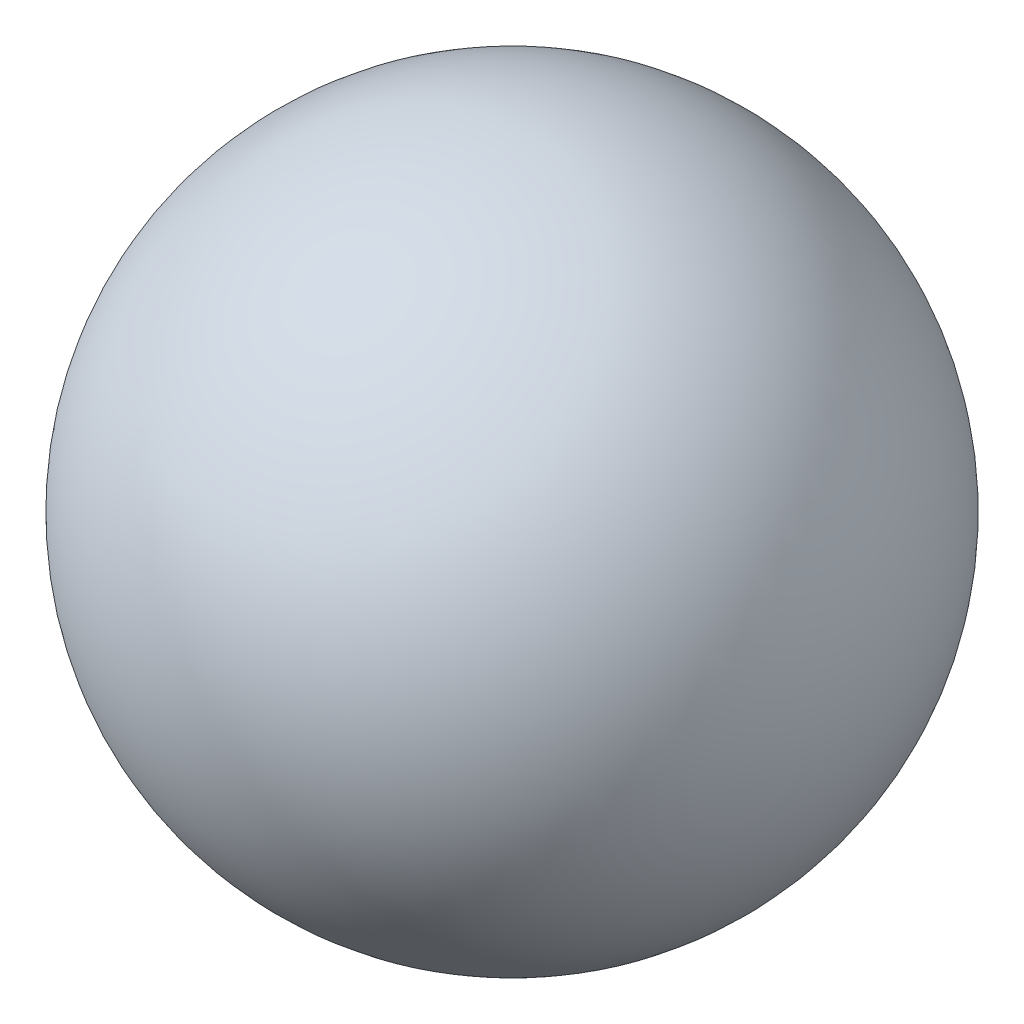
ISO-10303-21;
HEADER;
FILE_DESCRIPTION(('STEP AP214'),'2;1');
FILE_NAME('part.step','',(''),(''),'','','');
FILE_SCHEMA(('AUTOMOTIVE_DESIGN { 1 0 10303 214 1 1 1 1 }'));
ENDSEC;
DATA;
#1=APPLICATION_CONTEXT('core data for automotive mechanical design processes');
#2=APPLICATION_PROTOCOL_DEFINITION('international standard','automotive_design',2000,#1);
#3=PRODUCT_CONTEXT('',#1,'mechanical');
#4=PRODUCT('Part','Part','',(#3));
#5=PRODUCT_RELATED_PRODUCT_CATEGORY('part','',(#4));
#6=PRODUCT_DEFINITION_FORMATION('','',#4);
#7=PRODUCT_DEFINITION_CONTEXT('part definition',#1,'design');
#8=PRODUCT_DEFINITION('design','',#6,#7);
#9=PRODUCT_DEFINITION_SHAPE('','',#8);
#10=(LENGTH_UNIT() NAMED_UNIT(*) SI_UNIT(.MILLI.,.METRE.));
#11=(NAMED_UNIT(*) PLANE_ANGLE_UNIT() SI_UNIT($,.RADIAN.));
#12=(NAMED_UNIT(*) SI_UNIT($,.STERADIAN.) SOLID_ANGLE_UNIT());
#13=UNCERTAINTY_MEASURE_WITH_UNIT(LENGTH_MEASURE(1.E-05),#10,'distance_accuracy_value','');
#14=(GEOMETRIC_REPRESENTATION_CONTEXT(3) GLOBAL_UNCERTAINTY_ASSIGNED_CONTEXT((#13)) GLOBAL_UNIT_ASSIGNED_CONTEXT((#10,
#11,#12)) REPRESENTATION_CONTEXT('',''));
#15=CARTESIAN_POINT('',(0.,0.,0.));
#16=DIRECTION('',(0.,0.,1.));
#17=DIRECTION('',(1.,0.,0.));
#18=AXIS2_PLACEMENT_3D('',#15,#16,#17);
#19=CARTESIAN_POINT('',(0.,0.,0.));
#20=DIRECTION('',(0.,1.,0.));
#21=DIRECTION('',(1.,0.,0.));
#22=AXIS2_PLACEMENT_3D('',#19,#20,#21);
#23=SPHERICAL_SURFACE('',#22,38.5);
#24=CARTESIAN_POINT('',(0.,38.5,0.));
#25=VERTEX_POINT('',#24);
#26=VERTEX_LOOP('',#25);
#27=FACE_BOUND('',#26,.T.);
#28=ADVANCED_FACE('F35',(#27),#23,.T.);
#29=CLOSED_SHELL('',(#28));
#30=MANIFOLD_SOLID_BREP('B2',#29);
#31=ADVANCED_BREP_SHAPE_REPRESENTATION('',(#18,#30),#14);
#32=SHAPE_DEFINITION_REPRESENTATION(#9,#31);
ENDSEC;
END-ISO-10303-21;
